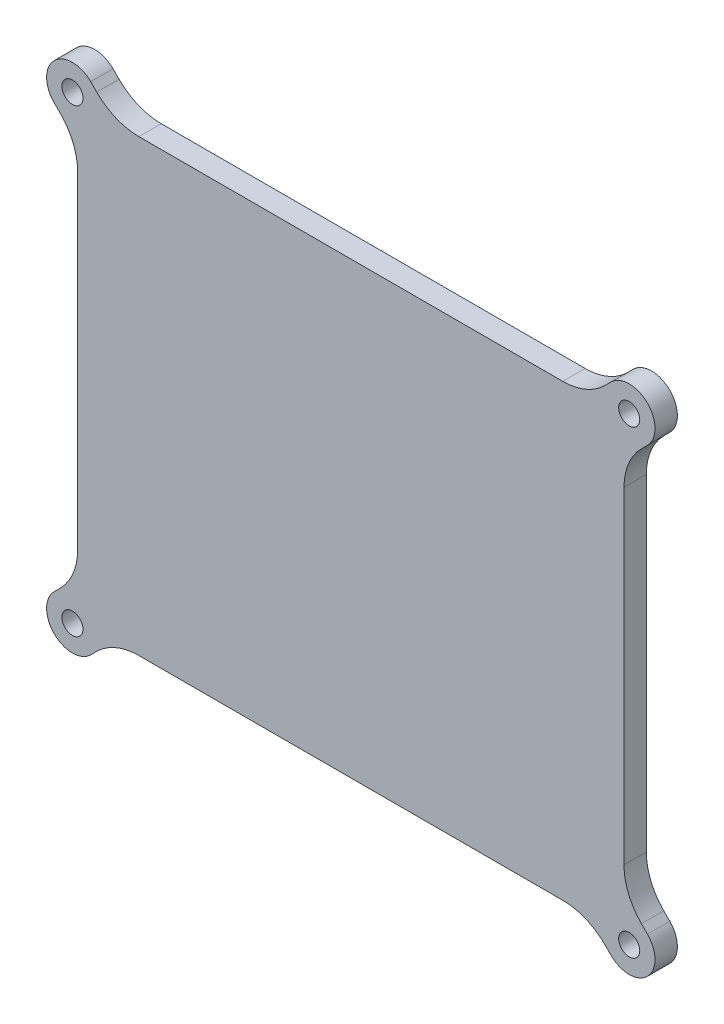
ISO-10303-21;
HEADER;
FILE_DESCRIPTION(('STEP AP214'),'2;1');
FILE_NAME('part.step','',(''),(''),'','','');
FILE_SCHEMA(('AUTOMOTIVE_DESIGN { 1 0 10303 214 1 1 1 1 }'));
ENDSEC;
DATA;
#1=APPLICATION_CONTEXT('core data for automotive mechanical design processes');
#2=APPLICATION_PROTOCOL_DEFINITION('international standard','automotive_design',2000,#1);
#3=PRODUCT_CONTEXT('',#1,'mechanical');
#4=PRODUCT('Part','Part','',(#3));
#5=PRODUCT_RELATED_PRODUCT_CATEGORY('part','',(#4));
#6=PRODUCT_DEFINITION_FORMATION('','',#4);
#7=PRODUCT_DEFINITION_CONTEXT('part definition',#1,'design');
#8=PRODUCT_DEFINITION('design','',#6,#7);
#9=PRODUCT_DEFINITION_SHAPE('','',#8);
#10=(LENGTH_UNIT() NAMED_UNIT(*) SI_UNIT(.MILLI.,.METRE.));
#11=(NAMED_UNIT(*) PLANE_ANGLE_UNIT() SI_UNIT($,.RADIAN.));
#12=(NAMED_UNIT(*) SI_UNIT($,.STERADIAN.) SOLID_ANGLE_UNIT());
#13=UNCERTAINTY_MEASURE_WITH_UNIT(LENGTH_MEASURE(1.E-05),#10,'distance_accuracy_value','');
#14=(GEOMETRIC_REPRESENTATION_CONTEXT(3) GLOBAL_UNCERTAINTY_ASSIGNED_CONTEXT((#13)) GLOBAL_UNIT_ASSIGNED_CONTEXT((#10,
#11,#12)) REPRESENTATION_CONTEXT('',''));
#15=CARTESIAN_POINT('',(0.,0.,0.));
#16=DIRECTION('',(0.,0.,1.));
#17=DIRECTION('',(1.,0.,0.));
#18=AXIS2_PLACEMENT_3D('',#15,#16,#17);
#19=CARTESIAN_POINT('',(-59.4959785319698,42.1232264271856,4.7625));
#20=DIRECTION('',(0.,0.,-1.));
#21=DIRECTION('',(-1.,0.,0.));
#22=AXIS2_PLACEMENT_3D('',#19,#20,#21);
#23=CYLINDRICAL_SURFACE('',#22,5.50000000000001);
#24=CARTESIAN_POINT('',(-59.4959785319698,42.1232264271856,0.));
#25=DIRECTION('',(0.,0.,1.));
#26=DIRECTION('',(1.,0.,0.));
#27=AXIS2_PLACEMENT_3D('',#24,#25,#26);
#28=CIRCLE('',#27,5.50000000000001);
#29=CARTESIAN_POINT('',(-55.6068912354438,46.0123137237116,0.));
#30=VERTEX_POINT('',#29);
#31=CARTESIAN_POINT('',(-63.3850658284958,38.2341391306596,0.));
#32=VERTEX_POINT('',#31);
#33=EDGE_CURVE('E233',#30,#32,#28,.T.);
#34=ORIENTED_EDGE('',*,*,#33,.T.);
#35=DIRECTION('',(0.,0.,-1.));
#36=VECTOR('',#35,1.);
#37=CARTESIAN_POINT('',(-63.3850658284958,38.2341391306596,4.7625));
#38=LINE('',#37,#36);
#39=CARTESIAN_POINT('',(-63.3850658284958,38.2341391306596,4.7625));
#40=VERTEX_POINT('',#39);
#41=EDGE_CURVE('E11',#40,#32,#38,.T.);
#42=ORIENTED_EDGE('',*,*,#41,.F.);
#43=CARTESIAN_POINT('',(-59.4959785319698,42.1232264271856,4.7625));
#44=DIRECTION('',(0.,0.,1.));
#45=DIRECTION('',(1.,0.,0.));
#46=AXIS2_PLACEMENT_3D('',#43,#44,#45);
#47=CIRCLE('',#46,5.50000000000001);
#48=CARTESIAN_POINT('',(-55.6068912354438,46.0123137237116,4.7625));
#49=VERTEX_POINT('',#48);
#50=EDGE_CURVE('E280',#49,#40,#47,.T.);
#51=ORIENTED_EDGE('',*,*,#50,.F.);
#52=DIRECTION('',(0.,0.,-1.));
#53=VECTOR('',#52,1.);
#54=CARTESIAN_POINT('',(-55.6068912354438,46.0123137237116,4.7625));
#55=LINE('',#54,#53);
#56=EDGE_CURVE('E229',#49,#30,#55,.T.);
#57=ORIENTED_EDGE('',*,*,#56,.T.);
#58=EDGE_LOOP('',(#34,#42,#51,#57));
#59=FACE_BOUND('',#58,.T.);
#60=ADVANCED_FACE('F41',(#59),#23,.T.);
#61=CARTESIAN_POINT('',(-63.3850658284958,38.2341391306596,4.7625));
#62=DIRECTION('',(0.707106781186551,0.707106781186544,0.));
#63=DIRECTION('',(-0.707106781186544,0.707106781186551,0.));
#64=AXIS2_PLACEMENT_3D('',#61,#62,#63);
#65=PLANE('',#64);
#66=DIRECTION('',(0.707106781186544,-0.707106781186551,0.));
#67=VECTOR('',#66,1.);
#68=CARTESIAN_POINT('',(-63.3850658284958,38.2341391306596,0.));
#69=LINE('',#68,#67);
#70=CARTESIAN_POINT('',(-62.1032420188573,36.952315321021,0.));
#71=VERTEX_POINT('',#70);
#72=EDGE_CURVE('E236',#32,#71,#69,.T.);
#73=ORIENTED_EDGE('',*,*,#72,.T.);
#74=DIRECTION('',(0.,0.,-1.));
#75=VECTOR('',#74,1.);
#76=CARTESIAN_POINT('',(-62.1032420188573,36.952315321021,4.7625));
#77=LINE('',#76,#75);
#78=CARTESIAN_POINT('',(-62.1032420188573,36.952315321021,4.7625));
#79=VERTEX_POINT('',#78);
#80=EDGE_CURVE('E49',#79,#71,#77,.T.);
#81=ORIENTED_EDGE('',*,*,#80,.F.);
#82=DIRECTION('',(0.707106781186544,-0.707106781186551,0.));
#83=VECTOR('',#82,1.);
#84=CARTESIAN_POINT('',(-63.3850658284958,38.2341391306596,4.7625));
#85=LINE('',#84,#83);
#86=EDGE_CURVE('E148',#40,#79,#85,.T.);
#87=ORIENTED_EDGE('',*,*,#86,.F.);
#88=ORIENTED_EDGE('',*,*,#41,.T.);
#89=EDGE_LOOP('',(#73,#81,#87,#88));
#90=FACE_BOUND('',#89,.T.);
#91=ADVANCED_FACE('F419',(#90),#65,.F.);
#92=CARTESIAN_POINT('',(-71.0834981399264,27.9720591999519,4.7625));
#93=DIRECTION('',(0.,0.,-1.));
#94=DIRECTION('',(-1.,0.,0.));
#95=AXIS2_PLACEMENT_3D('',#92,#93,#94);
#96=CYLINDRICAL_SURFACE('',#95,12.7);
#97=CARTESIAN_POINT('',(-71.0834981399264,27.9720591999519,0.));
#98=DIRECTION('',(0.,0.,-1.));
#99=DIRECTION('',(1.,0.,0.));
#100=AXIS2_PLACEMENT_3D('',#97,#98,#99);
#101=CIRCLE('',#100,12.7);
#102=CARTESIAN_POINT('',(-58.3834981399264,27.9720591999519,0.));
#103=VERTEX_POINT('',#102);
#104=EDGE_CURVE('E239',#71,#103,#101,.T.);
#105=ORIENTED_EDGE('',*,*,#104,.T.);
#106=DIRECTION('',(0.,0.,-1.));
#107=VECTOR('',#106,1.);
#108=CARTESIAN_POINT('',(-58.3834981399264,27.9720591999519,4.7625));
#109=LINE('',#108,#107);
#110=CARTESIAN_POINT('',(-58.3834981399264,27.9720591999519,4.7625));
#111=VERTEX_POINT('',#110);
#112=EDGE_CURVE('E335',#111,#103,#109,.T.);
#113=ORIENTED_EDGE('',*,*,#112,.F.);
#114=CARTESIAN_POINT('',(-71.0834981399264,27.9720591999519,4.7625));
#115=DIRECTION('',(0.,0.,-1.));
#116=DIRECTION('',(1.,0.,0.));
#117=AXIS2_PLACEMENT_3D('',#114,#115,#116);
#118=CIRCLE('',#117,12.7);
#119=EDGE_CURVE('E343',#79,#111,#118,.T.);
#120=ORIENTED_EDGE('',*,*,#119,.F.);
#121=ORIENTED_EDGE('',*,*,#80,.T.);
#122=EDGE_LOOP('',(#105,#113,#120,#121));
#123=FACE_BOUND('',#122,.T.);
#124=ADVANCED_FACE('F341',(#123),#96,.F.);
#125=CARTESIAN_POINT('',(-58.3834981399264,27.9720591999519,4.7625));
#126=DIRECTION('',(1.,0.,0.));
#127=DIRECTION('',(0.,1.,0.));
#128=AXIS2_PLACEMENT_3D('',#125,#126,#127);
#129=PLANE('',#128);
#130=DIRECTION('',(0.,-1.,0.));
#131=VECTOR('',#130,1.);
#132=CARTESIAN_POINT('',(-58.3834981399264,27.9720591999519,0.));
#133=LINE('',#132,#131);
#134=CARTESIAN_POINT('',(-58.3834981399264,-41.6755671296675,0.));
#135=VERTEX_POINT('',#134);
#136=EDGE_CURVE('E241',#103,#135,#133,.T.);
#137=ORIENTED_EDGE('',*,*,#136,.T.);
#138=DIRECTION('',(0.,0.,-1.));
#139=VECTOR('',#138,1.);
#140=CARTESIAN_POINT('',(-58.3834981399264,-41.6755671296675,4.7625));
#141=LINE('',#140,#139);
#142=CARTESIAN_POINT('',(-58.3834981399264,-41.6755671296675,4.7625));
#143=VERTEX_POINT('',#142);
#144=EDGE_CURVE('E332',#143,#135,#141,.T.);
#145=ORIENTED_EDGE('',*,*,#144,.F.);
#146=DIRECTION('',(0.,-1.,0.));
#147=VECTOR('',#146,1.);
#148=CARTESIAN_POINT('',(-58.3834981399264,27.9720591999519,4.7625));
#149=LINE('',#148,#147);
#150=EDGE_CURVE('E361',#111,#143,#149,.T.);
#151=ORIENTED_EDGE('',*,*,#150,.F.);
#152=ORIENTED_EDGE('',*,*,#112,.T.);
#153=EDGE_LOOP('',(#137,#145,#151,#152));
#154=FACE_BOUND('',#153,.T.);
#155=ADVANCED_FACE('F352',(#154),#129,.F.);
#156=CARTESIAN_POINT('',(-71.0834981399264,-41.6755671296675,4.7625));
#157=DIRECTION('',(0.,0.,-1.));
#158=DIRECTION('',(-1.,0.,0.));
#159=AXIS2_PLACEMENT_3D('',#156,#157,#158);
#160=CYLINDRICAL_SURFACE('',#159,12.7);
#161=CARTESIAN_POINT('',(-71.0834981399264,-41.6755671296675,0.));
#162=DIRECTION('',(0.,0.,-1.));
#163=DIRECTION('',(1.,0.,0.));
#164=AXIS2_PLACEMENT_3D('',#161,#162,#163);
#165=CIRCLE('',#164,12.7);
#166=CARTESIAN_POINT('',(-62.1032420188573,-50.6558232507367,0.));
#167=VERTEX_POINT('',#166);
#168=EDGE_CURVE('E243',#135,#167,#165,.T.);
#169=ORIENTED_EDGE('',*,*,#168,.T.);
#170=DIRECTION('',(0.,0.,-1.));
#171=VECTOR('',#170,1.);
#172=CARTESIAN_POINT('',(-62.1032420188573,-50.6558232507367,4.7625));
#173=LINE('',#172,#171);
#174=CARTESIAN_POINT('',(-62.1032420188573,-50.6558232507367,4.7625));
#175=VERTEX_POINT('',#174);
#176=EDGE_CURVE('E329',#175,#167,#173,.T.);
#177=ORIENTED_EDGE('',*,*,#176,.F.);
#178=CARTESIAN_POINT('',(-71.0834981399264,-41.6755671296675,4.7625));
#179=DIRECTION('',(0.,0.,-1.));
#180=DIRECTION('',(1.,0.,0.));
#181=AXIS2_PLACEMENT_3D('',#178,#179,#180);
#182=CIRCLE('',#181,12.7);
#183=EDGE_CURVE('E358',#143,#175,#182,.T.);
#184=ORIENTED_EDGE('',*,*,#183,.F.);
#185=ORIENTED_EDGE('',*,*,#144,.T.);
#186=EDGE_LOOP('',(#169,#177,#184,#185));
#187=FACE_BOUND('',#186,.T.);
#188=ADVANCED_FACE('F356',(#187),#160,.F.);
#189=CARTESIAN_POINT('',(-62.1032420188573,-50.6558232507367,4.7625));
#190=DIRECTION('',(0.707106781186547,-0.707106781186547,0.));
#191=DIRECTION('',(0.707106781186548,0.707106781186548,0.));
#192=AXIS2_PLACEMENT_3D('',#189,#190,#191);
#193=PLANE('',#192);
#194=DIRECTION('',(-0.707106781186547,-0.707106781186547,0.));
#195=VECTOR('',#194,1.);
#196=CARTESIAN_POINT('',(-62.1032420188573,-50.6558232507367,0.));
#197=LINE('',#196,#195);
#198=CARTESIAN_POINT('',(-63.3850658284958,-51.9376470603752,0.));
#199=VERTEX_POINT('',#198);
#200=EDGE_CURVE('E245',#167,#199,#197,.T.);
#201=ORIENTED_EDGE('',*,*,#200,.T.);
#202=DIRECTION('',(0.,0.,-1.));
#203=VECTOR('',#202,1.);
#204=CARTESIAN_POINT('',(-63.3850658284958,-51.9376470603752,4.7625));
#205=LINE('',#204,#203);
#206=CARTESIAN_POINT('',(-63.3850658284958,-51.9376470603752,4.7625));
#207=VERTEX_POINT('',#206);
#208=EDGE_CURVE('E326',#207,#199,#205,.T.);
#209=ORIENTED_EDGE('',*,*,#208,.F.);
#210=DIRECTION('',(-0.707106781186547,-0.707106781186547,0.));
#211=VECTOR('',#210,1.);
#212=CARTESIAN_POINT('',(-62.1032420188573,-50.6558232507367,4.7625));
#213=LINE('',#212,#211);
#214=EDGE_CURVE('E360',#175,#207,#213,.T.);
#215=ORIENTED_EDGE('',*,*,#214,.F.);
#216=ORIENTED_EDGE('',*,*,#176,.T.);
#217=EDGE_LOOP('',(#201,#209,#215,#216));
#218=FACE_BOUND('',#217,.T.);
#219=ADVANCED_FACE('F432',(#218),#193,.F.);
#220=CARTESIAN_POINT('',(-59.4959785319698,-55.8267343569012,4.7625));
#221=DIRECTION('',(0.,0.,-1.));
#222=DIRECTION('',(-1.,0.,0.));
#223=AXIS2_PLACEMENT_3D('',#220,#221,#222);
#224=CYLINDRICAL_SURFACE('',#223,5.50000000000001);
#225=CARTESIAN_POINT('',(-59.4959785319698,-55.8267343569012,0.));
#226=DIRECTION('',(0.,0.,1.));
#227=DIRECTION('',(1.,0.,0.));
#228=AXIS2_PLACEMENT_3D('',#225,#226,#227);
#229=CIRCLE('',#228,5.50000000000001);
#230=CARTESIAN_POINT('',(-55.6068912354438,-59.7158216534272,0.));
#231=VERTEX_POINT('',#230);
#232=EDGE_CURVE('E247',#199,#231,#229,.T.);
#233=ORIENTED_EDGE('',*,*,#232,.T.);
#234=DIRECTION('',(0.,0.,-1.));
#235=VECTOR('',#234,1.);
#236=CARTESIAN_POINT('',(-55.6068912354438,-59.7158216534272,4.7625));
#237=LINE('',#236,#235);
#238=CARTESIAN_POINT('',(-55.6068912354438,-59.7158216534272,4.7625));
#239=VERTEX_POINT('',#238);
#240=EDGE_CURVE('E323',#239,#231,#237,.T.);
#241=ORIENTED_EDGE('',*,*,#240,.F.);
#242=CARTESIAN_POINT('',(-59.4959785319698,-55.8267343569012,4.7625));
#243=DIRECTION('',(0.,0.,1.));
#244=DIRECTION('',(1.,0.,0.));
#245=AXIS2_PLACEMENT_3D('',#242,#243,#244);
#246=CIRCLE('',#245,5.50000000000001);
#247=EDGE_CURVE('E363',#207,#239,#246,.T.);
#248=ORIENTED_EDGE('',*,*,#247,.F.);
#249=ORIENTED_EDGE('',*,*,#208,.T.);
#250=EDGE_LOOP('',(#233,#241,#248,#249));
#251=FACE_BOUND('',#250,.T.);
#252=ADVANCED_FACE('F435',(#251),#224,.T.);
#253=CARTESIAN_POINT('',(-55.6068912354438,-59.7158216534272,4.7625));
#254=DIRECTION('',(-0.707106781186547,0.707106781186547,0.));
#255=DIRECTION('',(-0.707106781186548,-0.707106781186548,0.));
#256=AXIS2_PLACEMENT_3D('',#253,#254,#255);
#257=PLANE('',#256);
#258=DIRECTION('',(0.707106781186547,0.707106781186547,0.));
#259=VECTOR('',#258,1.);
#260=CARTESIAN_POINT('',(-55.6068912354438,-59.7158216534272,0.));
#261=LINE('',#260,#259);
#262=CARTESIAN_POINT('',(-54.3250674258052,-58.4339978437887,0.));
#263=VERTEX_POINT('',#262);
#264=EDGE_CURVE('E249',#231,#263,#261,.T.);
#265=ORIENTED_EDGE('',*,*,#264,.T.);
#266=DIRECTION('',(0.,0.,-1.));
#267=VECTOR('',#266,1.);
#268=CARTESIAN_POINT('',(-54.3250674258052,-58.4339978437887,4.7625));
#269=LINE('',#268,#267);
#270=CARTESIAN_POINT('',(-54.3250674258052,-58.4339978437887,4.7625));
#271=VERTEX_POINT('',#270);
#272=EDGE_CURVE('E320',#271,#263,#269,.T.);
#273=ORIENTED_EDGE('',*,*,#272,.F.);
#274=DIRECTION('',(0.707106781186547,0.707106781186547,0.));
#275=VECTOR('',#274,1.);
#276=CARTESIAN_POINT('',(-55.6068912354438,-59.7158216534272,4.7625));
#277=LINE('',#276,#275);
#278=EDGE_CURVE('E369',#239,#271,#277,.T.);
#279=ORIENTED_EDGE('',*,*,#278,.F.);
#280=ORIENTED_EDGE('',*,*,#240,.T.);
#281=EDGE_LOOP('',(#265,#273,#279,#280));
#282=FACE_BOUND('',#281,.T.);
#283=ADVANCED_FACE('F439',(#282),#257,.F.);
#284=CARTESIAN_POINT('',(-45.3448113047361,-67.4142539648578,4.7625));
#285=DIRECTION('',(0.,0.,-1.));
#286=DIRECTION('',(-1.,0.,0.));
#287=AXIS2_PLACEMENT_3D('',#284,#285,#286);
#288=CYLINDRICAL_SURFACE('',#287,12.7);
#289=CARTESIAN_POINT('',(-45.3448113047361,-67.4142539648578,0.));
#290=DIRECTION('',(0.,0.,-1.));
#291=DIRECTION('',(1.,0.,0.));
#292=AXIS2_PLACEMENT_3D('',#289,#290,#291);
#293=CIRCLE('',#292,12.7);
#294=CARTESIAN_POINT('',(-45.3448113047361,-54.7142539648578,0.));
#295=VERTEX_POINT('',#294);
#296=EDGE_CURVE('E251',#263,#295,#293,.T.);
#297=ORIENTED_EDGE('',*,*,#296,.T.);
#298=DIRECTION('',(0.,0.,-1.));
#299=VECTOR('',#298,1.);
#300=CARTESIAN_POINT('',(-45.3448113047361,-54.7142539648578,4.7625));
#301=LINE('',#300,#299);
#302=CARTESIAN_POINT('',(-45.3448113047361,-54.7142539648578,4.7625));
#303=VERTEX_POINT('',#302);
#304=EDGE_CURVE('E317',#303,#295,#301,.T.);
#305=ORIENTED_EDGE('',*,*,#304,.F.);
#306=CARTESIAN_POINT('',(-45.3448113047361,-67.4142539648578,4.7625));
#307=DIRECTION('',(0.,0.,-1.));
#308=DIRECTION('',(1.,0.,0.));
#309=AXIS2_PLACEMENT_3D('',#306,#307,#308);
#310=CIRCLE('',#309,12.7);
#311=EDGE_CURVE('E371',#271,#303,#310,.T.);
#312=ORIENTED_EDGE('',*,*,#311,.F.);
#313=ORIENTED_EDGE('',*,*,#272,.T.);
#314=EDGE_LOOP('',(#297,#305,#312,#313));
#315=FACE_BOUND('',#314,.T.);
#316=ADVANCED_FACE('F443',(#315),#288,.F.);
#317=CARTESIAN_POINT('',(-45.3448113047361,-54.7142539648578,4.7625));
#318=DIRECTION('',(0.,1.,0.));
#319=DIRECTION('',(0.,0.,1.));
#320=AXIS2_PLACEMENT_3D('',#317,#318,#319);
#321=PLANE('',#320);
#322=DIRECTION('',(1.,0.,0.));
#323=VECTOR('',#322,1.);
#324=CARTESIAN_POINT('',(-45.3448113047361,-54.7142539648578,0.));
#325=LINE('',#324,#323);
#326=CARTESIAN_POINT('',(44.9403150248832,-54.7142539648578,0.));
#327=VERTEX_POINT('',#326);
#328=EDGE_CURVE('E253',#295,#327,#325,.T.);
#329=ORIENTED_EDGE('',*,*,#328,.T.);
#330=DIRECTION('',(0.,0.,-1.));
#331=VECTOR('',#330,1.);
#332=CARTESIAN_POINT('',(44.9403150248832,-54.7142539648578,4.7625));
#333=LINE('',#332,#331);
#334=CARTESIAN_POINT('',(44.9403150248832,-54.7142539648578,4.7625));
#335=VERTEX_POINT('',#334);
#336=EDGE_CURVE('E314',#335,#327,#333,.T.);
#337=ORIENTED_EDGE('',*,*,#336,.F.);
#338=DIRECTION('',(1.,0.,0.));
#339=VECTOR('',#338,1.);
#340=CARTESIAN_POINT('',(-45.3448113047361,-54.7142539648578,4.7625));
#341=LINE('',#340,#339);
#342=EDGE_CURVE('E373',#303,#335,#341,.T.);
#343=ORIENTED_EDGE('',*,*,#342,.F.);
#344=ORIENTED_EDGE('',*,*,#304,.T.);
#345=EDGE_LOOP('',(#329,#337,#343,#344));
#346=FACE_BOUND('',#345,.T.);
#347=ADVANCED_FACE('F447',(#346),#321,.F.);
#348=CARTESIAN_POINT('',(44.9403150248832,-67.4142539648578,4.7625));
#349=DIRECTION('',(0.,0.,-1.));
#350=DIRECTION('',(-1.,0.,0.));
#351=AXIS2_PLACEMENT_3D('',#348,#349,#350);
#352=CYLINDRICAL_SURFACE('',#351,12.7);
#353=CARTESIAN_POINT('',(44.9403150248832,-67.4142539648578,0.));
#354=DIRECTION('',(0.,0.,-1.));
#355=DIRECTION('',(1.,0.,0.));
#356=AXIS2_PLACEMENT_3D('',#353,#354,#355);
#357=CIRCLE('',#356,12.7);
#358=CARTESIAN_POINT('',(53.9205711459524,-58.4339978437887,0.));
#359=VERTEX_POINT('',#358);
#360=EDGE_CURVE('E255',#327,#359,#357,.T.);
#361=ORIENTED_EDGE('',*,*,#360,.T.);
#362=DIRECTION('',(0.,0.,-1.));
#363=VECTOR('',#362,1.);
#364=CARTESIAN_POINT('',(53.9205711459524,-58.4339978437887,4.7625));
#365=LINE('',#364,#363);
#366=CARTESIAN_POINT('',(53.9205711459524,-58.4339978437887,4.7625));
#367=VERTEX_POINT('',#366);
#368=EDGE_CURVE('E311',#367,#359,#365,.T.);
#369=ORIENTED_EDGE('',*,*,#368,.F.);
#370=CARTESIAN_POINT('',(44.9403150248832,-67.4142539648578,4.7625));
#371=DIRECTION('',(0.,0.,-1.));
#372=DIRECTION('',(1.,0.,0.));
#373=AXIS2_PLACEMENT_3D('',#370,#371,#372);
#374=CIRCLE('',#373,12.7);
#375=EDGE_CURVE('E375',#335,#367,#374,.T.);
#376=ORIENTED_EDGE('',*,*,#375,.F.);
#377=ORIENTED_EDGE('',*,*,#336,.T.);
#378=EDGE_LOOP('',(#361,#369,#376,#377));
#379=FACE_BOUND('',#378,.T.);
#380=ADVANCED_FACE('F451',(#379),#352,.F.);
#381=CARTESIAN_POINT('',(53.9205711459524,-58.4339978437887,4.7625));
#382=DIRECTION('',(0.707106781186547,0.707106781186547,0.));
#383=DIRECTION('',(-0.707106781186548,0.707106781186548,0.));
#384=AXIS2_PLACEMENT_3D('',#381,#382,#383);
#385=PLANE('',#384);
#386=DIRECTION('',(0.707106781186547,-0.707106781186547,0.));
#387=VECTOR('',#386,1.);
#388=CARTESIAN_POINT('',(53.9205711459524,-58.4339978437887,0.));
#389=LINE('',#388,#387);
#390=CARTESIAN_POINT('',(55.202394955591,-59.7158216534272,0.));
#391=VERTEX_POINT('',#390);
#392=EDGE_CURVE('E257',#359,#391,#389,.T.);
#393=ORIENTED_EDGE('',*,*,#392,.T.);
#394=DIRECTION('',(0.,0.,-1.));
#395=VECTOR('',#394,1.);
#396=CARTESIAN_POINT('',(55.202394955591,-59.7158216534272,4.7625));
#397=LINE('',#396,#395);
#398=CARTESIAN_POINT('',(55.202394955591,-59.7158216534272,4.7625));
#399=VERTEX_POINT('',#398);
#400=EDGE_CURVE('E308',#399,#391,#397,.T.);
#401=ORIENTED_EDGE('',*,*,#400,.F.);
#402=DIRECTION('',(0.707106781186547,-0.707106781186547,0.));
#403=VECTOR('',#402,1.);
#404=CARTESIAN_POINT('',(53.9205711459524,-58.4339978437887,4.7625));
#405=LINE('',#404,#403);
#406=EDGE_CURVE('E377',#367,#399,#405,.T.);
#407=ORIENTED_EDGE('',*,*,#406,.F.);
#408=ORIENTED_EDGE('',*,*,#368,.T.);
#409=EDGE_LOOP('',(#393,#401,#407,#408));
#410=FACE_BOUND('',#409,.T.);
#411=ADVANCED_FACE('F455',(#410),#385,.F.);
#412=CARTESIAN_POINT('',(59.091482252117,-55.8267343569012,4.7625));
#413=DIRECTION('',(0.,0.,-1.));
#414=DIRECTION('',(-1.,0.,0.));
#415=AXIS2_PLACEMENT_3D('',#412,#413,#414);
#416=CYLINDRICAL_SURFACE('',#415,5.50000000000001);
#417=CARTESIAN_POINT('',(59.091482252117,-55.8267343569012,0.));
#418=DIRECTION('',(0.,0.,1.));
#419=DIRECTION('',(1.,0.,0.));
#420=AXIS2_PLACEMENT_3D('',#417,#418,#419);
#421=CIRCLE('',#420,5.50000000000001);
#422=CARTESIAN_POINT('',(62.980569548643,-51.9376470603752,0.));
#423=VERTEX_POINT('',#422);
#424=EDGE_CURVE('E259',#391,#423,#421,.T.);
#425=ORIENTED_EDGE('',*,*,#424,.T.);
#426=DIRECTION('',(0.,0.,-1.));
#427=VECTOR('',#426,1.);
#428=CARTESIAN_POINT('',(62.980569548643,-51.9376470603752,4.7625));
#429=LINE('',#428,#427);
#430=CARTESIAN_POINT('',(62.980569548643,-51.9376470603752,4.7625));
#431=VERTEX_POINT('',#430);
#432=EDGE_CURVE('E305',#431,#423,#429,.T.);
#433=ORIENTED_EDGE('',*,*,#432,.F.);
#434=CARTESIAN_POINT('',(59.091482252117,-55.8267343569012,4.7625));
#435=DIRECTION('',(0.,0.,1.));
#436=DIRECTION('',(1.,0.,0.));
#437=AXIS2_PLACEMENT_3D('',#434,#435,#436);
#438=CIRCLE('',#437,5.50000000000001);
#439=EDGE_CURVE('E379',#399,#431,#438,.T.);
#440=ORIENTED_EDGE('',*,*,#439,.F.);
#441=ORIENTED_EDGE('',*,*,#400,.T.);
#442=EDGE_LOOP('',(#425,#433,#440,#441));
#443=FACE_BOUND('',#442,.T.);
#444=ADVANCED_FACE('F459',(#443),#416,.T.);
#445=CARTESIAN_POINT('',(62.980569548643,-51.9376470603752,4.7625));
#446=DIRECTION('',(-0.707106781186551,-0.707106781186544,0.));
#447=DIRECTION('',(0.707106781186544,-0.707106781186551,0.));
#448=AXIS2_PLACEMENT_3D('',#445,#446,#447);
#449=PLANE('',#448);
#450=DIRECTION('',(-0.707106781186544,0.707106781186551,0.));
#451=VECTOR('',#450,1.);
#452=CARTESIAN_POINT('',(62.980569548643,-51.9376470603752,0.));
#453=LINE('',#452,#451);
#454=CARTESIAN_POINT('',(61.6987457390045,-50.6558232507367,0.));
#455=VERTEX_POINT('',#454);
#456=EDGE_CURVE('E261',#423,#455,#453,.T.);
#457=ORIENTED_EDGE('',*,*,#456,.T.);
#458=DIRECTION('',(0.,0.,-1.));
#459=VECTOR('',#458,1.);
#460=CARTESIAN_POINT('',(61.6987457390045,-50.6558232507367,4.7625));
#461=LINE('',#460,#459);
#462=CARTESIAN_POINT('',(61.6987457390045,-50.6558232507367,4.7625));
#463=VERTEX_POINT('',#462);
#464=EDGE_CURVE('E302',#463,#455,#461,.T.);
#465=ORIENTED_EDGE('',*,*,#464,.F.);
#466=DIRECTION('',(-0.707106781186544,0.707106781186551,0.));
#467=VECTOR('',#466,1.);
#468=CARTESIAN_POINT('',(62.980569548643,-51.9376470603752,4.7625));
#469=LINE('',#468,#467);
#470=EDGE_CURVE('E381',#431,#463,#469,.T.);
#471=ORIENTED_EDGE('',*,*,#470,.F.);
#472=ORIENTED_EDGE('',*,*,#432,.T.);
#473=EDGE_LOOP('',(#457,#465,#471,#472));
#474=FACE_BOUND('',#473,.T.);
#475=ADVANCED_FACE('F463',(#474),#449,.F.);
#476=CARTESIAN_POINT('',(70.6790018600736,-41.6755671296675,4.7625));
#477=DIRECTION('',(0.,0.,-1.));
#478=DIRECTION('',(-1.,0.,0.));
#479=AXIS2_PLACEMENT_3D('',#476,#477,#478);
#480=CYLINDRICAL_SURFACE('',#479,12.7);
#481=CARTESIAN_POINT('',(70.6790018600736,-41.6755671296675,0.));
#482=DIRECTION('',(0.,0.,-1.));
#483=DIRECTION('',(1.,0.,0.));
#484=AXIS2_PLACEMENT_3D('',#481,#482,#483);
#485=CIRCLE('',#484,12.7);
#486=CARTESIAN_POINT('',(57.9790018600736,-41.6755671296675,0.));
#487=VERTEX_POINT('',#486);
#488=EDGE_CURVE('E263',#455,#487,#485,.T.);
#489=ORIENTED_EDGE('',*,*,#488,.T.);
#490=DIRECTION('',(0.,0.,-1.));
#491=VECTOR('',#490,1.);
#492=CARTESIAN_POINT('',(57.9790018600736,-41.6755671296675,4.7625));
#493=LINE('',#492,#491);
#494=CARTESIAN_POINT('',(57.9790018600736,-41.6755671296675,4.7625));
#495=VERTEX_POINT('',#494);
#496=EDGE_CURVE('E299',#495,#487,#493,.T.);
#497=ORIENTED_EDGE('',*,*,#496,.F.);
#498=CARTESIAN_POINT('',(70.6790018600736,-41.6755671296675,4.7625));
#499=DIRECTION('',(0.,0.,-1.));
#500=DIRECTION('',(1.,0.,0.));
#501=AXIS2_PLACEMENT_3D('',#498,#499,#500);
#502=CIRCLE('',#501,12.7);
#503=EDGE_CURVE('E383',#463,#495,#502,.T.);
#504=ORIENTED_EDGE('',*,*,#503,.F.);
#505=ORIENTED_EDGE('',*,*,#464,.T.);
#506=EDGE_LOOP('',(#489,#497,#504,#505));
#507=FACE_BOUND('',#506,.T.);
#508=ADVANCED_FACE('F467',(#507),#480,.F.);
#509=CARTESIAN_POINT('',(57.9790018600736,-41.6755671296675,4.7625));
#510=DIRECTION('',(-1.,0.,0.));
#511=DIRECTION('',(0.,-1.,0.));
#512=AXIS2_PLACEMENT_3D('',#509,#510,#511);
#513=PLANE('',#512);
#514=DIRECTION('',(0.,1.,0.));
#515=VECTOR('',#514,1.);
#516=CARTESIAN_POINT('',(57.9790018600736,-41.6755671296675,0.));
#517=LINE('',#516,#515);
#518=CARTESIAN_POINT('',(57.9790018600736,27.9720591999518,0.));
#519=VERTEX_POINT('',#518);
#520=EDGE_CURVE('E265',#487,#519,#517,.T.);
#521=ORIENTED_EDGE('',*,*,#520,.T.);
#522=DIRECTION('',(0.,0.,-1.));
#523=VECTOR('',#522,1.);
#524=CARTESIAN_POINT('',(57.9790018600736,27.9720591999518,4.7625));
#525=LINE('',#524,#523);
#526=CARTESIAN_POINT('',(57.9790018600736,27.9720591999518,4.7625));
#527=VERTEX_POINT('',#526);
#528=EDGE_CURVE('E296',#527,#519,#525,.T.);
#529=ORIENTED_EDGE('',*,*,#528,.F.);
#530=DIRECTION('',(0.,1.,0.));
#531=VECTOR('',#530,1.);
#532=CARTESIAN_POINT('',(57.9790018600736,-41.6755671296675,4.7625));
#533=LINE('',#532,#531);
#534=EDGE_CURVE('E385',#495,#527,#533,.T.);
#535=ORIENTED_EDGE('',*,*,#534,.F.);
#536=ORIENTED_EDGE('',*,*,#496,.T.);
#537=EDGE_LOOP('',(#521,#529,#535,#536));
#538=FACE_BOUND('',#537,.T.);
#539=ADVANCED_FACE('F471',(#538),#513,.F.);
#540=CARTESIAN_POINT('',(70.6790018600736,27.9720591999518,4.7625));
#541=DIRECTION('',(0.,0.,-1.));
#542=DIRECTION('',(-1.,0.,0.));
#543=AXIS2_PLACEMENT_3D('',#540,#541,#542);
#544=CYLINDRICAL_SURFACE('',#543,12.7);
#545=CARTESIAN_POINT('',(70.6790018600736,27.9720591999518,0.));
#546=DIRECTION('',(0.,0.,-1.));
#547=DIRECTION('',(1.,0.,0.));
#548=AXIS2_PLACEMENT_3D('',#545,#546,#547);
#549=CIRCLE('',#548,12.7);
#550=CARTESIAN_POINT('',(61.6987457390044,36.952315321021,0.));
#551=VERTEX_POINT('',#550);
#552=EDGE_CURVE('E267',#519,#551,#549,.T.);
#553=ORIENTED_EDGE('',*,*,#552,.T.);
#554=DIRECTION('',(0.,0.,-1.));
#555=VECTOR('',#554,1.);
#556=CARTESIAN_POINT('',(61.6987457390044,36.952315321021,4.7625));
#557=LINE('',#556,#555);
#558=CARTESIAN_POINT('',(61.6987457390044,36.952315321021,4.7625));
#559=VERTEX_POINT('',#558);
#560=EDGE_CURVE('E293',#559,#551,#557,.T.);
#561=ORIENTED_EDGE('',*,*,#560,.F.);
#562=CARTESIAN_POINT('',(70.6790018600736,27.9720591999518,4.7625));
#563=DIRECTION('',(0.,0.,-1.));
#564=DIRECTION('',(1.,0.,0.));
#565=AXIS2_PLACEMENT_3D('',#562,#563,#564);
#566=CIRCLE('',#565,12.7);
#567=EDGE_CURVE('E387',#527,#559,#566,.T.);
#568=ORIENTED_EDGE('',*,*,#567,.F.);
#569=ORIENTED_EDGE('',*,*,#528,.T.);
#570=EDGE_LOOP('',(#553,#561,#568,#569));
#571=FACE_BOUND('',#570,.T.);
#572=ADVANCED_FACE('F475',(#571),#544,.F.);
#573=CARTESIAN_POINT('',(61.6987457390044,36.952315321021,4.7625));
#574=DIRECTION('',(-0.707106781186549,0.707106781186546,0.));
#575=DIRECTION('',(-0.707106781186546,-0.707106781186549,0.));
#576=AXIS2_PLACEMENT_3D('',#573,#574,#575);
#577=PLANE('',#576);
#578=DIRECTION('',(0.707106781186546,0.707106781186549,0.));
#579=VECTOR('',#578,1.);
#580=CARTESIAN_POINT('',(61.6987457390044,36.952315321021,0.));
#581=LINE('',#580,#579);
#582=CARTESIAN_POINT('',(62.980569548643,38.2341391306596,0.));
#583=VERTEX_POINT('',#582);
#584=EDGE_CURVE('E269',#551,#583,#581,.T.);
#585=ORIENTED_EDGE('',*,*,#584,.T.);
#586=DIRECTION('',(0.,0.,-1.));
#587=VECTOR('',#586,1.);
#588=CARTESIAN_POINT('',(62.980569548643,38.2341391306596,4.7625));
#589=LINE('',#588,#587);
#590=CARTESIAN_POINT('',(62.980569548643,38.2341391306596,4.7625));
#591=VERTEX_POINT('',#590);
#592=EDGE_CURVE('E290',#591,#583,#589,.T.);
#593=ORIENTED_EDGE('',*,*,#592,.F.);
#594=DIRECTION('',(0.707106781186546,0.707106781186549,0.));
#595=VECTOR('',#594,1.);
#596=CARTESIAN_POINT('',(61.6987457390044,36.952315321021,4.7625));
#597=LINE('',#596,#595);
#598=EDGE_CURVE('E389',#559,#591,#597,.T.);
#599=ORIENTED_EDGE('',*,*,#598,.F.);
#600=ORIENTED_EDGE('',*,*,#560,.T.);
#601=EDGE_LOOP('',(#585,#593,#599,#600));
#602=FACE_BOUND('',#601,.T.);
#603=ADVANCED_FACE('F479',(#602),#577,.F.);
#604=CARTESIAN_POINT('',(59.091482252117,42.1232264271856,4.7625));
#605=DIRECTION('',(0.,0.,-1.));
#606=DIRECTION('',(-1.,0.,0.));
#607=AXIS2_PLACEMENT_3D('',#604,#605,#606);
#608=CYLINDRICAL_SURFACE('',#607,5.50000000000001);
#609=CARTESIAN_POINT('',(59.091482252117,42.1232264271856,0.));
#610=DIRECTION('',(0.,0.,1.));
#611=DIRECTION('',(1.,0.,0.));
#612=AXIS2_PLACEMENT_3D('',#609,#610,#611);
#613=CIRCLE('',#612,5.50000000000001);
#614=CARTESIAN_POINT('',(55.202394955591,46.0123137237116,0.));
#615=VERTEX_POINT('',#614);
#616=EDGE_CURVE('E271',#583,#615,#613,.T.);
#617=ORIENTED_EDGE('',*,*,#616,.T.);
#618=DIRECTION('',(0.,0.,-1.));
#619=VECTOR('',#618,1.);
#620=CARTESIAN_POINT('',(55.202394955591,46.0123137237116,4.7625));
#621=LINE('',#620,#619);
#622=CARTESIAN_POINT('',(55.202394955591,46.0123137237116,4.7625));
#623=VERTEX_POINT('',#622);
#624=EDGE_CURVE('E287',#623,#615,#621,.T.);
#625=ORIENTED_EDGE('',*,*,#624,.F.);
#626=CARTESIAN_POINT('',(59.091482252117,42.1232264271856,4.7625));
#627=DIRECTION('',(0.,0.,1.));
#628=DIRECTION('',(1.,0.,0.));
#629=AXIS2_PLACEMENT_3D('',#626,#627,#628);
#630=CIRCLE('',#629,5.50000000000001);
#631=EDGE_CURVE('E391',#591,#623,#630,.T.);
#632=ORIENTED_EDGE('',*,*,#631,.F.);
#633=ORIENTED_EDGE('',*,*,#592,.T.);
#634=EDGE_LOOP('',(#617,#625,#632,#633));
#635=FACE_BOUND('',#634,.T.);
#636=ADVANCED_FACE('F483',(#635),#608,.T.);
#637=CARTESIAN_POINT('',(55.202394955591,46.0123137237116,4.7625));
#638=DIRECTION('',(0.707106781186547,-0.707106781186547,0.));
#639=DIRECTION('',(0.707106781186548,0.707106781186548,0.));
#640=AXIS2_PLACEMENT_3D('',#637,#638,#639);
#641=PLANE('',#640);
#642=DIRECTION('',(-0.707106781186547,-0.707106781186547,0.));
#643=VECTOR('',#642,1.);
#644=CARTESIAN_POINT('',(55.202394955591,46.0123137237116,0.));
#645=LINE('',#644,#643);
#646=CARTESIAN_POINT('',(53.9205711459524,44.7304899140731,0.));
#647=VERTEX_POINT('',#646);
#648=EDGE_CURVE('E273',#615,#647,#645,.T.);
#649=ORIENTED_EDGE('',*,*,#648,.T.);
#650=DIRECTION('',(0.,0.,-1.));
#651=VECTOR('',#650,1.);
#652=CARTESIAN_POINT('',(53.9205711459524,44.7304899140731,4.7625));
#653=LINE('',#652,#651);
#654=CARTESIAN_POINT('',(53.9205711459524,44.7304899140731,4.7625));
#655=VERTEX_POINT('',#654);
#656=EDGE_CURVE('E284',#655,#647,#653,.T.);
#657=ORIENTED_EDGE('',*,*,#656,.F.);
#658=DIRECTION('',(-0.707106781186547,-0.707106781186547,0.));
#659=VECTOR('',#658,1.);
#660=CARTESIAN_POINT('',(55.202394955591,46.0123137237116,4.7625));
#661=LINE('',#660,#659);
#662=EDGE_CURVE('E393',#623,#655,#661,.T.);
#663=ORIENTED_EDGE('',*,*,#662,.F.);
#664=ORIENTED_EDGE('',*,*,#624,.T.);
#665=EDGE_LOOP('',(#649,#657,#663,#664));
#666=FACE_BOUND('',#665,.T.);
#667=ADVANCED_FACE('F399',(#666),#641,.F.);
#668=CARTESIAN_POINT('',(44.9403150248833,53.7107460351422,4.7625));
#669=DIRECTION('',(0.,0.,-1.));
#670=DIRECTION('',(-1.,0.,0.));
#671=AXIS2_PLACEMENT_3D('',#668,#669,#670);
#672=CYLINDRICAL_SURFACE('',#671,12.7);
#673=CARTESIAN_POINT('',(44.9403150248833,53.7107460351422,0.));
#674=DIRECTION('',(0.,0.,-1.));
#675=DIRECTION('',(1.,0.,0.));
#676=AXIS2_PLACEMENT_3D('',#673,#674,#675);
#677=CIRCLE('',#676,12.7);
#678=CARTESIAN_POINT('',(44.9403150248832,41.0107460351422,0.));
#679=VERTEX_POINT('',#678);
#680=EDGE_CURVE('E275',#647,#679,#677,.T.);
#681=ORIENTED_EDGE('',*,*,#680,.T.);
#682=DIRECTION('',(0.,0.,-1.));
#683=VECTOR('',#682,1.);
#684=CARTESIAN_POINT('',(44.9403150248832,41.0107460351422,4.7625));
#685=LINE('',#684,#683);
#686=CARTESIAN_POINT('',(44.9403150248832,41.0107460351422,4.7625));
#687=VERTEX_POINT('',#686);
#688=EDGE_CURVE('E224',#687,#679,#685,.T.);
#689=ORIENTED_EDGE('',*,*,#688,.F.);
#690=CARTESIAN_POINT('',(44.9403150248833,53.7107460351422,4.7625));
#691=DIRECTION('',(0.,0.,-1.));
#692=DIRECTION('',(1.,0.,0.));
#693=AXIS2_PLACEMENT_3D('',#690,#691,#692);
#694=CIRCLE('',#693,12.7);
#695=EDGE_CURVE('E215',#655,#687,#694,.T.);
#696=ORIENTED_EDGE('',*,*,#695,.F.);
#697=ORIENTED_EDGE('',*,*,#656,.T.);
#698=EDGE_LOOP('',(#681,#689,#696,#697));
#699=FACE_BOUND('',#698,.T.);
#700=ADVANCED_FACE('F403',(#699),#672,.F.);
#701=CARTESIAN_POINT('',(44.9403150248832,41.0107460351422,4.7625));
#702=DIRECTION('',(0.,-1.,0.));
#703=DIRECTION('',(1.,0.,0.));
#704=AXIS2_PLACEMENT_3D('',#701,#702,#703);
#705=PLANE('',#704);
#706=DIRECTION('',(-1.,0.,0.));
#707=VECTOR('',#706,1.);
#708=CARTESIAN_POINT('',(44.9403150248832,41.0107460351422,0.));
#709=LINE('',#708,#707);
#710=CARTESIAN_POINT('',(-45.3448113047361,41.0107460351422,0.));
#711=VERTEX_POINT('',#710);
#712=EDGE_CURVE('E223',#679,#711,#709,.T.);
#713=ORIENTED_EDGE('',*,*,#712,.T.);
#714=DIRECTION('',(0.,0.,-1.));
#715=VECTOR('',#714,1.);
#716=CARTESIAN_POINT('',(-45.3448113047361,41.0107460351422,4.7625));
#717=LINE('',#716,#715);
#718=CARTESIAN_POINT('',(-45.3448113047361,41.0107460351422,4.7625));
#719=VERTEX_POINT('',#718);
#720=EDGE_CURVE('E220',#719,#711,#717,.T.);
#721=ORIENTED_EDGE('',*,*,#720,.F.);
#722=DIRECTION('',(-1.,0.,0.));
#723=VECTOR('',#722,1.);
#724=CARTESIAN_POINT('',(44.9403150248832,41.0107460351422,4.7625));
#725=LINE('',#724,#723);
#726=EDGE_CURVE('E209',#687,#719,#725,.T.);
#727=ORIENTED_EDGE('',*,*,#726,.F.);
#728=ORIENTED_EDGE('',*,*,#688,.T.);
#729=EDGE_LOOP('',(#713,#721,#727,#728));
#730=FACE_BOUND('',#729,.T.);
#731=ADVANCED_FACE('F221',(#730),#705,.F.);
#732=CARTESIAN_POINT('',(-45.3448113047361,53.7107460351422,4.7625));
#733=DIRECTION('',(0.,0.,-1.));
#734=DIRECTION('',(-1.,0.,0.));
#735=AXIS2_PLACEMENT_3D('',#732,#733,#734);
#736=CYLINDRICAL_SURFACE('',#735,12.7);
#737=CARTESIAN_POINT('',(-45.3448113047361,53.7107460351422,0.));
#738=DIRECTION('',(0.,0.,-1.));
#739=DIRECTION('',(1.,0.,0.));
#740=AXIS2_PLACEMENT_3D('',#737,#738,#739);
#741=CIRCLE('',#740,12.7);
#742=CARTESIAN_POINT('',(-54.3250674258053,44.7304899140731,0.));
#743=VERTEX_POINT('',#742);
#744=EDGE_CURVE('E134',#711,#743,#741,.T.);
#745=ORIENTED_EDGE('',*,*,#744,.T.);
#746=DIRECTION('',(0.,0.,-1.));
#747=VECTOR('',#746,1.);
#748=CARTESIAN_POINT('',(-54.3250674258053,44.7304899140731,4.7625));
#749=LINE('',#748,#747);
#750=CARTESIAN_POINT('',(-54.3250674258053,44.7304899140731,4.7625));
#751=VERTEX_POINT('',#750);
#752=EDGE_CURVE('E225',#751,#743,#749,.T.);
#753=ORIENTED_EDGE('',*,*,#752,.F.);
#754=CARTESIAN_POINT('',(-45.3448113047361,53.7107460351422,4.7625));
#755=DIRECTION('',(0.,0.,-1.));
#756=DIRECTION('',(1.,0.,0.));
#757=AXIS2_PLACEMENT_3D('',#754,#755,#756);
#758=CIRCLE('',#757,12.7);
#759=EDGE_CURVE('E213',#719,#751,#758,.T.);
#760=ORIENTED_EDGE('',*,*,#759,.F.);
#761=ORIENTED_EDGE('',*,*,#720,.T.);
#762=EDGE_LOOP('',(#745,#753,#760,#761));
#763=FACE_BOUND('',#762,.T.);
#764=ADVANCED_FACE('F227',(#763),#736,.F.);
#765=CARTESIAN_POINT('',(-54.3250674258053,44.7304899140731,4.7625));
#766=DIRECTION('',(-0.707106781186551,-0.707106781186544,0.));
#767=DIRECTION('',(0.707106781186544,-0.707106781186551,0.));
#768=AXIS2_PLACEMENT_3D('',#765,#766,#767);
#769=PLANE('',#768);
#770=DIRECTION('',(-0.707106781186544,0.707106781186551,0.));
#771=VECTOR('',#770,1.);
#772=CARTESIAN_POINT('',(-54.3250674258053,44.7304899140731,0.));
#773=LINE('',#772,#771);
#774=EDGE_CURVE('E140',#743,#30,#773,.T.);
#775=ORIENTED_EDGE('',*,*,#774,.T.);
#776=ORIENTED_EDGE('',*,*,#56,.F.);
#777=DIRECTION('',(-0.707106781186544,0.707106781186551,0.));
#778=VECTOR('',#777,1.);
#779=CARTESIAN_POINT('',(-54.3250674258053,44.7304899140731,4.7625));
#780=LINE('',#779,#778);
#781=EDGE_CURVE('E57',#751,#49,#780,.T.);
#782=ORIENTED_EDGE('',*,*,#781,.F.);
#783=ORIENTED_EDGE('',*,*,#752,.T.);
#784=EDGE_LOOP('',(#775,#776,#782,#783));
#785=FACE_BOUND('',#784,.T.);
#786=ADVANCED_FACE('F407',(#785),#769,.F.);
#787=CARTESIAN_POINT('',(-59.4959785319698,42.1232264271856,4.7625));
#788=DIRECTION('',(0.,0.,1.));
#789=DIRECTION('',(1.,0.,0.));
#790=AXIS2_PLACEMENT_3D('',#787,#788,#789);
#791=PLANE('',#790);
#792=CARTESIAN_POINT('',(-59.4959785319698,-55.8267343569012,4.7625));
#793=DIRECTION('',(0.,0.,1.));
#794=DIRECTION('',(1.,0.,0.));
#795=AXIS2_PLACEMENT_3D('',#792,#793,#794);
#796=CIRCLE('',#795,2.24999999999999);
#797=CARTESIAN_POINT('',(-57.2459785319698,-55.8267343569012,4.7625));
#798=VERTEX_POINT('',#797);
#799=EDGE_CURVE('E570',#798,#798,#796,.T.);
#800=ORIENTED_EDGE('',*,*,#799,.F.);
#801=EDGE_LOOP('',(#800));
#802=FACE_BOUND('',#801,.T.);
#803=CARTESIAN_POINT('',(-59.4959785319698,42.1232264271856,4.7625));
#804=DIRECTION('',(0.,0.,1.));
#805=DIRECTION('',(1.,0.,0.));
#806=AXIS2_PLACEMENT_3D('',#803,#804,#805);
#807=CIRCLE('',#806,2.24999999999999);
#808=CARTESIAN_POINT('',(-57.2459785319698,42.1232264271856,4.7625));
#809=VERTEX_POINT('',#808);
#810=EDGE_CURVE('E572',#809,#809,#807,.T.);
#811=ORIENTED_EDGE('',*,*,#810,.F.);
#812=EDGE_LOOP('',(#811));
#813=FACE_BOUND('',#812,.T.);
#814=CARTESIAN_POINT('',(59.091482252117,42.1232264271856,4.7625));
#815=DIRECTION('',(0.,0.,1.));
#816=DIRECTION('',(1.,0.,0.));
#817=AXIS2_PLACEMENT_3D('',#814,#815,#816);
#818=CIRCLE('',#817,2.24999999999999);
#819=CARTESIAN_POINT('',(61.341482252117,42.1232264271856,4.7625));
#820=VERTEX_POINT('',#819);
#821=EDGE_CURVE('E580',#820,#820,#818,.T.);
#822=ORIENTED_EDGE('',*,*,#821,.F.);
#823=EDGE_LOOP('',(#822));
#824=FACE_BOUND('',#823,.T.);
#825=CARTESIAN_POINT('',(59.091482252117,-55.8267343569012,4.7625));
#826=DIRECTION('',(0.,0.,1.));
#827=DIRECTION('',(1.,0.,0.));
#828=AXIS2_PLACEMENT_3D('',#825,#826,#827);
#829=CIRCLE('',#828,2.24999999999999);
#830=CARTESIAN_POINT('',(61.341482252117,-55.8267343569012,4.7625));
#831=VERTEX_POINT('',#830);
#832=EDGE_CURVE('E586',#831,#831,#829,.T.);
#833=ORIENTED_EDGE('',*,*,#832,.F.);
#834=EDGE_LOOP('',(#833));
#835=FACE_BOUND('',#834,.T.);
#836=ORIENTED_EDGE('',*,*,#50,.T.);
#837=ORIENTED_EDGE('',*,*,#86,.T.);
#838=ORIENTED_EDGE('',*,*,#119,.T.);
#839=ORIENTED_EDGE('',*,*,#150,.T.);
#840=ORIENTED_EDGE('',*,*,#183,.T.);
#841=ORIENTED_EDGE('',*,*,#214,.T.);
#842=ORIENTED_EDGE('',*,*,#247,.T.);
#843=ORIENTED_EDGE('',*,*,#278,.T.);
#844=ORIENTED_EDGE('',*,*,#311,.T.);
#845=ORIENTED_EDGE('',*,*,#342,.T.);
#846=ORIENTED_EDGE('',*,*,#375,.T.);
#847=ORIENTED_EDGE('',*,*,#406,.T.);
#848=ORIENTED_EDGE('',*,*,#439,.T.);
#849=ORIENTED_EDGE('',*,*,#470,.T.);
#850=ORIENTED_EDGE('',*,*,#503,.T.);
#851=ORIENTED_EDGE('',*,*,#534,.T.);
#852=ORIENTED_EDGE('',*,*,#567,.T.);
#853=ORIENTED_EDGE('',*,*,#598,.T.);
#854=ORIENTED_EDGE('',*,*,#631,.T.);
#855=ORIENTED_EDGE('',*,*,#662,.T.);
#856=ORIENTED_EDGE('',*,*,#695,.T.);
#857=ORIENTED_EDGE('',*,*,#726,.T.);
#858=ORIENTED_EDGE('',*,*,#759,.T.);
#859=ORIENTED_EDGE('',*,*,#781,.T.);
#860=EDGE_LOOP('',(#836,#837,#838,#839,#840,#841,#842,#843,#844,#845,#846,#847,#848,#849,#850,
#851,#852,#853,#854,#855,#856,#857,#858,#859));
#861=FACE_BOUND('',#860,.T.);
#862=ADVANCED_FACE('F211',(#802,#813,#824,#835,#861),#791,.T.);
#863=CARTESIAN_POINT('',(-59.4959785319698,42.1232264271856,0.));
#864=DIRECTION('',(0.,0.,1.));
#865=DIRECTION('',(1.,0.,0.));
#866=AXIS2_PLACEMENT_3D('',#863,#864,#865);
#867=PLANE('',#866);
#868=CARTESIAN_POINT('',(-59.4959785319698,-55.8267343569012,0.));
#869=DIRECTION('',(0.,0.,1.));
#870=DIRECTION('',(1.,0.,0.));
#871=AXIS2_PLACEMENT_3D('',#868,#869,#870);
#872=CIRCLE('',#871,2.25);
#873=CARTESIAN_POINT('',(-57.2459785319698,-55.8267343569012,0.));
#874=VERTEX_POINT('',#873);
#875=EDGE_CURVE('E567',#874,#874,#872,.T.);
#876=ORIENTED_EDGE('',*,*,#875,.T.);
#877=EDGE_LOOP('',(#876));
#878=FACE_BOUND('',#877,.T.);
#879=CARTESIAN_POINT('',(-59.4959785319698,42.1232264271856,0.));
#880=DIRECTION('',(0.,0.,1.));
#881=DIRECTION('',(1.,0.,0.));
#882=AXIS2_PLACEMENT_3D('',#879,#880,#881);
#883=CIRCLE('',#882,2.25);
#884=CARTESIAN_POINT('',(-57.2459785319698,42.1232264271856,0.));
#885=VERTEX_POINT('',#884);
#886=EDGE_CURVE('E577',#885,#885,#883,.T.);
#887=ORIENTED_EDGE('',*,*,#886,.T.);
#888=EDGE_LOOP('',(#887));
#889=FACE_BOUND('',#888,.T.);
#890=CARTESIAN_POINT('',(59.091482252117,42.1232264271856,0.));
#891=DIRECTION('',(0.,0.,1.));
#892=DIRECTION('',(1.,0.,0.));
#893=AXIS2_PLACEMENT_3D('',#890,#891,#892);
#894=CIRCLE('',#893,2.25);
#895=CARTESIAN_POINT('',(61.341482252117,42.1232264271856,0.));
#896=VERTEX_POINT('',#895);
#897=EDGE_CURVE('E583',#896,#896,#894,.T.);
#898=ORIENTED_EDGE('',*,*,#897,.T.);
#899=EDGE_LOOP('',(#898));
#900=FACE_BOUND('',#899,.T.);
#901=CARTESIAN_POINT('',(59.091482252117,-55.8267343569012,0.));
#902=DIRECTION('',(0.,0.,1.));
#903=DIRECTION('',(1.,0.,0.));
#904=AXIS2_PLACEMENT_3D('',#901,#902,#903);
#905=CIRCLE('',#904,2.25);
#906=CARTESIAN_POINT('',(61.341482252117,-55.8267343569012,0.));
#907=VERTEX_POINT('',#906);
#908=EDGE_CURVE('E237',#907,#907,#905,.T.);
#909=ORIENTED_EDGE('',*,*,#908,.T.);
#910=EDGE_LOOP('',(#909));
#911=FACE_BOUND('',#910,.T.);
#912=ORIENTED_EDGE('',*,*,#33,.F.);
#913=ORIENTED_EDGE('',*,*,#774,.F.);
#914=ORIENTED_EDGE('',*,*,#744,.F.);
#915=ORIENTED_EDGE('',*,*,#712,.F.);
#916=ORIENTED_EDGE('',*,*,#680,.F.);
#917=ORIENTED_EDGE('',*,*,#648,.F.);
#918=ORIENTED_EDGE('',*,*,#616,.F.);
#919=ORIENTED_EDGE('',*,*,#584,.F.);
#920=ORIENTED_EDGE('',*,*,#552,.F.);
#921=ORIENTED_EDGE('',*,*,#520,.F.);
#922=ORIENTED_EDGE('',*,*,#488,.F.);
#923=ORIENTED_EDGE('',*,*,#456,.F.);
#924=ORIENTED_EDGE('',*,*,#424,.F.);
#925=ORIENTED_EDGE('',*,*,#392,.F.);
#926=ORIENTED_EDGE('',*,*,#360,.F.);
#927=ORIENTED_EDGE('',*,*,#328,.F.);
#928=ORIENTED_EDGE('',*,*,#296,.F.);
#929=ORIENTED_EDGE('',*,*,#264,.F.);
#930=ORIENTED_EDGE('',*,*,#232,.F.);
#931=ORIENTED_EDGE('',*,*,#200,.F.);
#932=ORIENTED_EDGE('',*,*,#168,.F.);
#933=ORIENTED_EDGE('',*,*,#136,.F.);
#934=ORIENTED_EDGE('',*,*,#104,.F.);
#935=ORIENTED_EDGE('',*,*,#72,.F.);
#936=EDGE_LOOP('',(#912,#913,#914,#915,#916,#917,#918,#919,#920,#921,#922,#923,#924,#925,#926,
#927,#928,#929,#930,#931,#932,#933,#934,#935));
#937=FACE_BOUND('',#936,.T.);
#938=ADVANCED_FACE('F347',(#878,#889,#900,#911,#937),#867,.F.);
#939=CARTESIAN_POINT('',(59.091482252117,-55.8267343569012,4.7625));
#940=DIRECTION('',(0.,0.,1.));
#941=DIRECTION('',(1.,0.,0.));
#942=AXIS2_PLACEMENT_3D('',#939,#940,#941);
#943=CYLINDRICAL_SURFACE('',#942,2.25);
#944=ORIENTED_EDGE('',*,*,#908,.F.);
#945=EDGE_LOOP('',(#944));
#946=FACE_BOUND('',#945,.T.);
#947=ORIENTED_EDGE('',*,*,#832,.T.);
#948=EDGE_LOOP('',(#947));
#949=FACE_BOUND('',#948,.T.);
#950=ADVANCED_FACE('F522',(#946,#949),#943,.F.);
#951=CARTESIAN_POINT('',(59.091482252117,42.1232264271856,4.7625));
#952=DIRECTION('',(0.,0.,1.));
#953=DIRECTION('',(1.,0.,0.));
#954=AXIS2_PLACEMENT_3D('',#951,#952,#953);
#955=CYLINDRICAL_SURFACE('',#954,2.25);
#956=ORIENTED_EDGE('',*,*,#897,.F.);
#957=EDGE_LOOP('',(#956));
#958=FACE_BOUND('',#957,.T.);
#959=ORIENTED_EDGE('',*,*,#821,.T.);
#960=EDGE_LOOP('',(#959));
#961=FACE_BOUND('',#960,.T.);
#962=ADVANCED_FACE('F531',(#958,#961),#955,.F.);
#963=CARTESIAN_POINT('',(-59.4959785319698,42.1232264271856,4.7625));
#964=DIRECTION('',(0.,0.,1.));
#965=DIRECTION('',(1.,0.,0.));
#966=AXIS2_PLACEMENT_3D('',#963,#964,#965);
#967=CYLINDRICAL_SURFACE('',#966,2.25);
#968=ORIENTED_EDGE('',*,*,#886,.F.);
#969=EDGE_LOOP('',(#968));
#970=FACE_BOUND('',#969,.T.);
#971=ORIENTED_EDGE('',*,*,#810,.T.);
#972=EDGE_LOOP('',(#971));
#973=FACE_BOUND('',#972,.T.);
#974=ADVANCED_FACE('F541',(#970,#973),#967,.F.);
#975=CARTESIAN_POINT('',(-59.4959785319698,-55.8267343569012,4.7625));
#976=DIRECTION('',(0.,0.,1.));
#977=DIRECTION('',(1.,0.,0.));
#978=AXIS2_PLACEMENT_3D('',#975,#976,#977);
#979=CYLINDRICAL_SURFACE('',#978,2.25);
#980=ORIENTED_EDGE('',*,*,#875,.F.);
#981=EDGE_LOOP('',(#980));
#982=FACE_BOUND('',#981,.T.);
#983=ORIENTED_EDGE('',*,*,#799,.T.);
#984=EDGE_LOOP('',(#983));
#985=FACE_BOUND('',#984,.T.);
#986=ADVANCED_FACE('F551',(#982,#985),#979,.F.);
#987=CLOSED_SHELL('',(#60,#91,#124,#155,#188,#219,#252,#283,#316,#347,#380,#411,#444,#475,#508,
#539,#572,#603,#636,#667,#700,#731,#764,#786,#862,#938,#950,#962,#974,#986));
#988=MANIFOLD_SOLID_BREP('B2',#987);
#989=ADVANCED_BREP_SHAPE_REPRESENTATION('',(#18,#988),#14);
#990=SHAPE_DEFINITION_REPRESENTATION(#9,#989);
ENDSEC;
END-ISO-10303-21;
